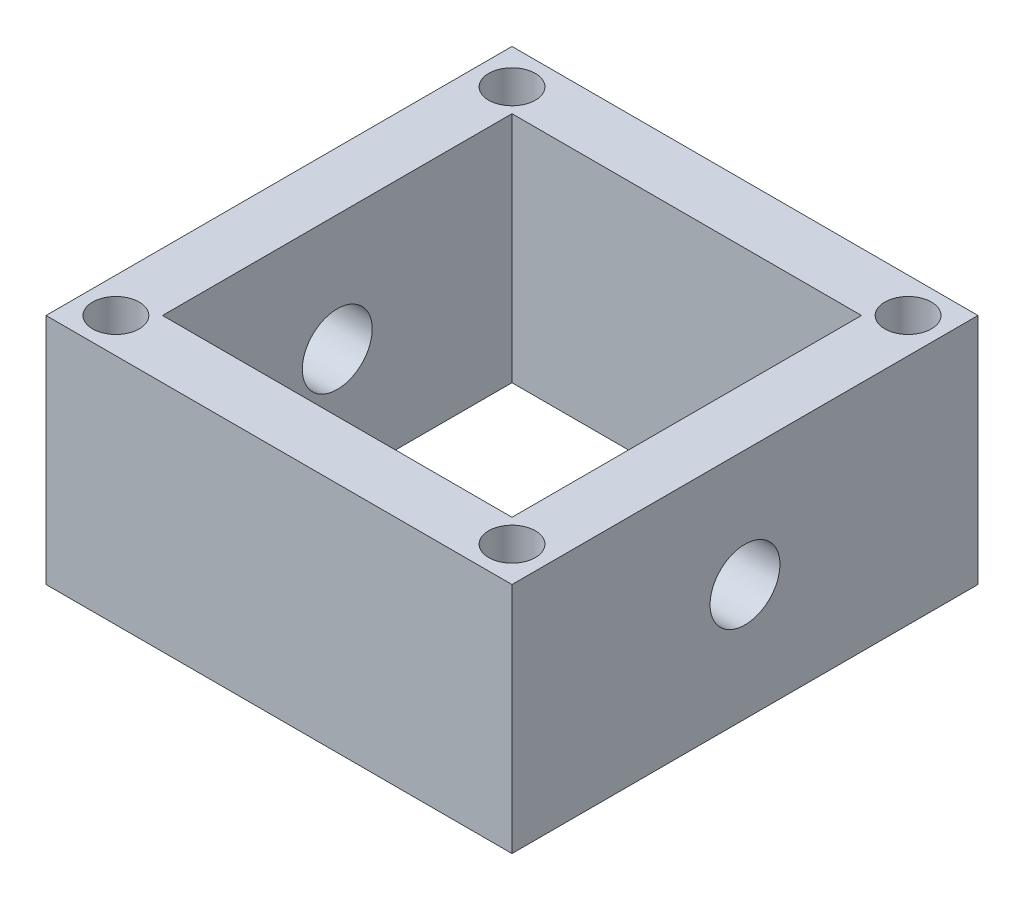
ISO-10303-21;
HEADER;
FILE_DESCRIPTION(('STEP AP214'),'2;1');
FILE_NAME('part.step','',(''),(''),'','','');
FILE_SCHEMA(('AUTOMOTIVE_DESIGN { 1 0 10303 214 1 1 1 1 }'));
ENDSEC;
DATA;
#1=APPLICATION_CONTEXT('core data for automotive mechanical design processes');
#2=APPLICATION_PROTOCOL_DEFINITION('international standard','automotive_design',2000,#1);
#3=PRODUCT_CONTEXT('',#1,'mechanical');
#4=PRODUCT('Part','Part','',(#3));
#5=PRODUCT_RELATED_PRODUCT_CATEGORY('part','',(#4));
#6=PRODUCT_DEFINITION_FORMATION('','',#4);
#7=PRODUCT_DEFINITION_CONTEXT('part definition',#1,'design');
#8=PRODUCT_DEFINITION('design','',#6,#7);
#9=PRODUCT_DEFINITION_SHAPE('','',#8);
#10=(LENGTH_UNIT() NAMED_UNIT(*) SI_UNIT(.MILLI.,.METRE.));
#11=(NAMED_UNIT(*) PLANE_ANGLE_UNIT() SI_UNIT($,.RADIAN.));
#12=(NAMED_UNIT(*) SI_UNIT($,.STERADIAN.) SOLID_ANGLE_UNIT());
#13=UNCERTAINTY_MEASURE_WITH_UNIT(LENGTH_MEASURE(1.E-05),#10,'distance_accuracy_value','');
#14=(GEOMETRIC_REPRESENTATION_CONTEXT(3) GLOBAL_UNCERTAINTY_ASSIGNED_CONTEXT((#13)) GLOBAL_UNIT_ASSIGNED_CONTEXT((#10,
#11,#12)) REPRESENTATION_CONTEXT('',''));
#15=CARTESIAN_POINT('',(0.,0.,0.));
#16=DIRECTION('',(0.,0.,1.));
#17=DIRECTION('',(1.,0.,0.));
#18=AXIS2_PLACEMENT_3D('',#15,#16,#17);
#19=CARTESIAN_POINT('',(0.,10.,0.));
#20=DIRECTION('',(0.,1.,0.));
#21=DIRECTION('',(0.,0.,1.));
#22=AXIS2_PLACEMENT_3D('',#19,#20,#21);
#23=PLANE('',#22);
#24=CARTESIAN_POINT('',(-8.5,10.,8.5));
#25=DIRECTION('',(0.,1.,0.));
#26=DIRECTION('',(0.,0.,1.));
#27=AXIS2_PLACEMENT_3D('',#24,#25,#26);
#28=CIRCLE('',#27,1.);
#29=CARTESIAN_POINT('',(-8.5,10.,9.5));
#30=VERTEX_POINT('',#29);
#31=EDGE_CURVE('E236',#30,#30,#28,.T.);
#32=ORIENTED_EDGE('',*,*,#31,.F.);
#33=EDGE_LOOP('',(#32));
#34=FACE_BOUND('',#33,.T.);
#35=CARTESIAN_POINT('',(8.5,10.,8.5));
#36=DIRECTION('',(0.,1.,0.));
#37=DIRECTION('',(0.,0.,1.));
#38=AXIS2_PLACEMENT_3D('',#35,#36,#37);
#39=CIRCLE('',#38,1.);
#40=CARTESIAN_POINT('',(8.5,10.,9.5));
#41=VERTEX_POINT('',#40);
#42=EDGE_CURVE('E242',#41,#41,#39,.T.);
#43=ORIENTED_EDGE('',*,*,#42,.F.);
#44=EDGE_LOOP('',(#43));
#45=FACE_BOUND('',#44,.T.);
#46=CARTESIAN_POINT('',(8.5,10.,-8.5));
#47=DIRECTION('',(0.,1.,0.));
#48=DIRECTION('',(0.,0.,1.));
#49=AXIS2_PLACEMENT_3D('',#46,#47,#48);
#50=CIRCLE('',#49,1.);
#51=CARTESIAN_POINT('',(8.5,10.,-7.5));
#52=VERTEX_POINT('',#51);
#53=EDGE_CURVE('E230',#52,#52,#50,.T.);
#54=ORIENTED_EDGE('',*,*,#53,.F.);
#55=EDGE_LOOP('',(#54));
#56=FACE_BOUND('',#55,.T.);
#57=CARTESIAN_POINT('',(-8.5,10.,-8.5));
#58=DIRECTION('',(0.,1.,0.));
#59=DIRECTION('',(0.,0.,1.));
#60=AXIS2_PLACEMENT_3D('',#57,#58,#59);
#61=CIRCLE('',#60,1.);
#62=CARTESIAN_POINT('',(-8.5,10.,-7.5));
#63=VERTEX_POINT('',#62);
#64=EDGE_CURVE('E227',#63,#63,#61,.T.);
#65=ORIENTED_EDGE('',*,*,#64,.F.);
#66=EDGE_LOOP('',(#65));
#67=FACE_BOUND('',#66,.T.);
#68=DIRECTION('',(0.,0.,-1.));
#69=VECTOR('',#68,1.);
#70=CARTESIAN_POINT('',(10.,10.,-10.));
#71=LINE('',#70,#69);
#72=CARTESIAN_POINT('',(10.,10.,10.));
#73=VERTEX_POINT('',#72);
#74=CARTESIAN_POINT('',(10.,10.,-10.));
#75=VERTEX_POINT('',#74);
#76=EDGE_CURVE('E141',#73,#75,#71,.T.);
#77=ORIENTED_EDGE('',*,*,#76,.T.);
#78=DIRECTION('',(-1.,0.,0.));
#79=VECTOR('',#78,1.);
#80=CARTESIAN_POINT('',(-10.,10.,-10.));
#81=LINE('',#80,#79);
#82=CARTESIAN_POINT('',(-10.,10.,-10.));
#83=VERTEX_POINT('',#82);
#84=EDGE_CURVE('E144',#75,#83,#81,.T.);
#85=ORIENTED_EDGE('',*,*,#84,.T.);
#86=DIRECTION('',(0.,0.,1.));
#87=VECTOR('',#86,1.);
#88=CARTESIAN_POINT('',(-10.,10.,-10.));
#89=LINE('',#88,#87);
#90=CARTESIAN_POINT('',(-10.,10.,10.));
#91=VERTEX_POINT('',#90);
#92=EDGE_CURVE('E147',#83,#91,#89,.T.);
#93=ORIENTED_EDGE('',*,*,#92,.T.);
#94=DIRECTION('',(1.,0.,0.));
#95=VECTOR('',#94,1.);
#96=CARTESIAN_POINT('',(-10.,10.,10.));
#97=LINE('',#96,#95);
#98=EDGE_CURVE('E149',#91,#73,#97,.T.);
#99=ORIENTED_EDGE('',*,*,#98,.T.);
#100=EDGE_LOOP('',(#77,#85,#93,#99));
#101=FACE_BOUND('',#100,.T.);
#102=DIRECTION('',(-1.,0.,0.));
#103=VECTOR('',#102,1.);
#104=CARTESIAN_POINT('',(-7.5,10.,-7.5));
#105=LINE('',#104,#103);
#106=CARTESIAN_POINT('',(7.5,10.,-7.5));
#107=VERTEX_POINT('',#106);
#108=CARTESIAN_POINT('',(-7.5,10.,-7.5));
#109=VERTEX_POINT('',#108);
#110=EDGE_CURVE('E111',#107,#109,#105,.T.);
#111=ORIENTED_EDGE('',*,*,#110,.F.);
#112=DIRECTION('',(0.,0.,-1.));
#113=VECTOR('',#112,1.);
#114=CARTESIAN_POINT('',(7.5,10.,-7.5));
#115=LINE('',#114,#113);
#116=CARTESIAN_POINT('',(7.5,10.,7.5));
#117=VERTEX_POINT('',#116);
#118=EDGE_CURVE('E103',#117,#107,#115,.T.);
#119=ORIENTED_EDGE('',*,*,#118,.F.);
#120=DIRECTION('',(1.,0.,0.));
#121=VECTOR('',#120,1.);
#122=CARTESIAN_POINT('',(-7.5,10.,7.5));
#123=LINE('',#122,#121);
#124=CARTESIAN_POINT('',(-7.5,10.,7.5));
#125=VERTEX_POINT('',#124);
#126=EDGE_CURVE('E125',#125,#117,#123,.T.);
#127=ORIENTED_EDGE('',*,*,#126,.F.);
#128=DIRECTION('',(0.,0.,1.));
#129=VECTOR('',#128,1.);
#130=CARTESIAN_POINT('',(-7.5,10.,-7.5));
#131=LINE('',#130,#129);
#132=EDGE_CURVE('E123',#109,#125,#131,.T.);
#133=ORIENTED_EDGE('',*,*,#132,.F.);
#134=EDGE_LOOP('',(#111,#119,#127,#133));
#135=FACE_BOUND('',#134,.T.);
#136=ADVANCED_FACE('F37',(#34,#45,#56,#67,#101,#135),#23,.T.);
#137=CARTESIAN_POINT('',(0.,0.,0.));
#138=DIRECTION('',(0.,1.,0.));
#139=DIRECTION('',(0.,0.,1.));
#140=AXIS2_PLACEMENT_3D('',#137,#138,#139);
#141=PLANE('',#140);
#142=DIRECTION('',(0.,0.,-1.));
#143=VECTOR('',#142,1.);
#144=CARTESIAN_POINT('',(10.,0.,-10.));
#145=LINE('',#144,#143);
#146=CARTESIAN_POINT('',(10.,0.,10.));
#147=VERTEX_POINT('',#146);
#148=CARTESIAN_POINT('',(10.,0.,-10.));
#149=VERTEX_POINT('',#148);
#150=EDGE_CURVE('E119',#147,#149,#145,.T.);
#151=ORIENTED_EDGE('',*,*,#150,.F.);
#152=DIRECTION('',(1.,0.,0.));
#153=VECTOR('',#152,1.);
#154=CARTESIAN_POINT('',(-10.,0.,10.));
#155=LINE('',#154,#153);
#156=CARTESIAN_POINT('',(-10.,0.,10.));
#157=VERTEX_POINT('',#156);
#158=EDGE_CURVE('E145',#157,#147,#155,.T.);
#159=ORIENTED_EDGE('',*,*,#158,.F.);
#160=DIRECTION('',(0.,0.,1.));
#161=VECTOR('',#160,1.);
#162=CARTESIAN_POINT('',(-10.,0.,-10.));
#163=LINE('',#162,#161);
#164=CARTESIAN_POINT('',(-10.,0.,-10.));
#165=VERTEX_POINT('',#164);
#166=EDGE_CURVE('E156',#165,#157,#163,.T.);
#167=ORIENTED_EDGE('',*,*,#166,.F.);
#168=DIRECTION('',(-1.,0.,0.));
#169=VECTOR('',#168,1.);
#170=CARTESIAN_POINT('',(-10.,0.,-10.));
#171=LINE('',#170,#169);
#172=EDGE_CURVE('E154',#149,#165,#171,.T.);
#173=ORIENTED_EDGE('',*,*,#172,.F.);
#174=EDGE_LOOP('',(#151,#159,#167,#173));
#175=FACE_BOUND('',#174,.T.);
#176=DIRECTION('',(0.,0.,-1.));
#177=VECTOR('',#176,1.);
#178=CARTESIAN_POINT('',(7.5,0.,-7.5));
#179=LINE('',#178,#177);
#180=CARTESIAN_POINT('',(7.5,0.,7.5));
#181=VERTEX_POINT('',#180);
#182=CARTESIAN_POINT('',(7.5,0.,-7.5));
#183=VERTEX_POINT('',#182);
#184=EDGE_CURVE('E61',#181,#183,#179,.T.);
#185=ORIENTED_EDGE('',*,*,#184,.T.);
#186=DIRECTION('',(-1.,0.,0.));
#187=VECTOR('',#186,1.);
#188=CARTESIAN_POINT('',(-7.5,0.,-7.5));
#189=LINE('',#188,#187);
#190=CARTESIAN_POINT('',(-7.5,0.,-7.5));
#191=VERTEX_POINT('',#190);
#192=EDGE_CURVE('E118',#183,#191,#189,.T.);
#193=ORIENTED_EDGE('',*,*,#192,.T.);
#194=DIRECTION('',(0.,0.,1.));
#195=VECTOR('',#194,1.);
#196=CARTESIAN_POINT('',(-7.5,0.,-7.5));
#197=LINE('',#196,#195);
#198=CARTESIAN_POINT('',(-7.5,0.,7.5));
#199=VERTEX_POINT('',#198);
#200=EDGE_CURVE('E133',#191,#199,#197,.T.);
#201=ORIENTED_EDGE('',*,*,#200,.T.);
#202=DIRECTION('',(1.,0.,0.));
#203=VECTOR('',#202,1.);
#204=CARTESIAN_POINT('',(-7.5,0.,7.5));
#205=LINE('',#204,#203);
#206=EDGE_CURVE('E112',#199,#181,#205,.T.);
#207=ORIENTED_EDGE('',*,*,#206,.T.);
#208=EDGE_LOOP('',(#185,#193,#201,#207));
#209=FACE_BOUND('',#208,.T.);
#210=ADVANCED_FACE('F175',(#175,#209),#141,.F.);
#211=CARTESIAN_POINT('',(10.,10.,-10.));
#212=DIRECTION('',(-1.,0.,0.));
#213=DIRECTION('',(0.,0.,1.));
#214=AXIS2_PLACEMENT_3D('',#211,#212,#213);
#215=PLANE('',#214);
#216=CARTESIAN_POINT('',(10.,5.,0.));
#217=DIRECTION('',(-1.,0.,0.));
#218=DIRECTION('',(0.,0.,1.));
#219=AXIS2_PLACEMENT_3D('',#216,#217,#218);
#220=CIRCLE('',#219,1.5);
#221=CARTESIAN_POINT('',(10.,5.,1.5));
#222=VERTEX_POINT('',#221);
#223=EDGE_CURVE('E219',#222,#222,#220,.T.);
#224=ORIENTED_EDGE('',*,*,#223,.T.);
#225=EDGE_LOOP('',(#224));
#226=FACE_BOUND('',#225,.T.);
#227=ORIENTED_EDGE('',*,*,#150,.T.);
#228=DIRECTION('',(0.,-1.,0.));
#229=VECTOR('',#228,1.);
#230=CARTESIAN_POINT('',(10.,10.,-10.));
#231=LINE('',#230,#229);
#232=EDGE_CURVE('E11',#75,#149,#231,.T.);
#233=ORIENTED_EDGE('',*,*,#232,.F.);
#234=ORIENTED_EDGE('',*,*,#76,.F.);
#235=DIRECTION('',(0.,-1.,0.));
#236=VECTOR('',#235,1.);
#237=CARTESIAN_POINT('',(10.,10.,10.));
#238=LINE('',#237,#236);
#239=EDGE_CURVE('E151',#73,#147,#238,.T.);
#240=ORIENTED_EDGE('',*,*,#239,.T.);
#241=EDGE_LOOP('',(#227,#233,#234,#240));
#242=FACE_BOUND('',#241,.T.);
#243=ADVANCED_FACE('F39',(#226,#242),#215,.F.);
#244=CARTESIAN_POINT('',(-10.,10.,-10.));
#245=DIRECTION('',(0.,0.,1.));
#246=DIRECTION('',(1.,0.,0.));
#247=AXIS2_PLACEMENT_3D('',#244,#245,#246);
#248=PLANE('',#247);
#249=ORIENTED_EDGE('',*,*,#172,.T.);
#250=DIRECTION('',(0.,-1.,0.));
#251=VECTOR('',#250,1.);
#252=CARTESIAN_POINT('',(-10.,10.,-10.));
#253=LINE('',#252,#251);
#254=EDGE_CURVE('E46',#83,#165,#253,.T.);
#255=ORIENTED_EDGE('',*,*,#254,.F.);
#256=ORIENTED_EDGE('',*,*,#84,.F.);
#257=ORIENTED_EDGE('',*,*,#232,.T.);
#258=EDGE_LOOP('',(#249,#255,#256,#257));
#259=FACE_BOUND('',#258,.T.);
#260=ADVANCED_FACE('F185',(#259),#248,.F.);
#261=CARTESIAN_POINT('',(-10.,10.,-10.));
#262=DIRECTION('',(1.,0.,0.));
#263=DIRECTION('',(0.,0.,-1.));
#264=AXIS2_PLACEMENT_3D('',#261,#262,#263);
#265=PLANE('',#264);
#266=CARTESIAN_POINT('',(-10.,5.,0.));
#267=DIRECTION('',(-1.,0.,0.));
#268=DIRECTION('',(0.,0.,1.));
#269=AXIS2_PLACEMENT_3D('',#266,#267,#268);
#270=CIRCLE('',#269,1.5);
#271=CARTESIAN_POINT('',(-10.,5.,1.5));
#272=VERTEX_POINT('',#271);
#273=EDGE_CURVE('E221',#272,#272,#270,.T.);
#274=ORIENTED_EDGE('',*,*,#273,.F.);
#275=EDGE_LOOP('',(#274));
#276=FACE_BOUND('',#275,.T.);
#277=ORIENTED_EDGE('',*,*,#166,.T.);
#278=DIRECTION('',(0.,-1.,0.));
#279=VECTOR('',#278,1.);
#280=CARTESIAN_POINT('',(-10.,10.,10.));
#281=LINE('',#280,#279);
#282=EDGE_CURVE('E161',#91,#157,#281,.T.);
#283=ORIENTED_EDGE('',*,*,#282,.F.);
#284=ORIENTED_EDGE('',*,*,#92,.F.);
#285=ORIENTED_EDGE('',*,*,#254,.T.);
#286=EDGE_LOOP('',(#277,#283,#284,#285));
#287=FACE_BOUND('',#286,.T.);
#288=ADVANCED_FACE('F169',(#276,#287),#265,.F.);
#289=CARTESIAN_POINT('',(-10.,10.,10.));
#290=DIRECTION('',(0.,0.,-1.));
#291=DIRECTION('',(-1.,0.,0.));
#292=AXIS2_PLACEMENT_3D('',#289,#290,#291);
#293=PLANE('',#292);
#294=ORIENTED_EDGE('',*,*,#158,.T.);
#295=ORIENTED_EDGE('',*,*,#239,.F.);
#296=ORIENTED_EDGE('',*,*,#98,.F.);
#297=ORIENTED_EDGE('',*,*,#282,.T.);
#298=EDGE_LOOP('',(#294,#295,#296,#297));
#299=FACE_BOUND('',#298,.T.);
#300=ADVANCED_FACE('F179',(#299),#293,.F.);
#301=CARTESIAN_POINT('',(7.5,10.,-7.5));
#302=DIRECTION('',(-1.,0.,0.));
#303=DIRECTION('',(0.,0.,1.));
#304=AXIS2_PLACEMENT_3D('',#301,#302,#303);
#305=PLANE('',#304);
#306=CARTESIAN_POINT('',(7.5,5.,0.));
#307=DIRECTION('',(-1.,0.,0.));
#308=DIRECTION('',(0.,0.,1.));
#309=AXIS2_PLACEMENT_3D('',#306,#307,#308);
#310=CIRCLE('',#309,1.5);
#311=CARTESIAN_POINT('',(7.5,5.,1.5));
#312=VERTEX_POINT('',#311);
#313=EDGE_CURVE('E131',#312,#312,#310,.T.);
#314=ORIENTED_EDGE('',*,*,#313,.F.);
#315=EDGE_LOOP('',(#314));
#316=FACE_BOUND('',#315,.T.);
#317=ORIENTED_EDGE('',*,*,#184,.F.);
#318=DIRECTION('',(0.,-1.,0.));
#319=VECTOR('',#318,1.);
#320=CARTESIAN_POINT('',(7.5,10.,7.5));
#321=LINE('',#320,#319);
#322=EDGE_CURVE('E107',#117,#181,#321,.T.);
#323=ORIENTED_EDGE('',*,*,#322,.F.);
#324=ORIENTED_EDGE('',*,*,#118,.T.);
#325=DIRECTION('',(0.,-1.,0.));
#326=VECTOR('',#325,1.);
#327=CARTESIAN_POINT('',(7.5,10.,-7.5));
#328=LINE('',#327,#326);
#329=EDGE_CURVE('E106',#107,#183,#328,.T.);
#330=ORIENTED_EDGE('',*,*,#329,.T.);
#331=EDGE_LOOP('',(#317,#323,#324,#330));
#332=FACE_BOUND('',#331,.T.);
#333=ADVANCED_FACE('F105',(#316,#332),#305,.T.);
#334=CARTESIAN_POINT('',(-7.5,10.,-7.5));
#335=DIRECTION('',(0.,0.,1.));
#336=DIRECTION('',(1.,0.,0.));
#337=AXIS2_PLACEMENT_3D('',#334,#335,#336);
#338=PLANE('',#337);
#339=ORIENTED_EDGE('',*,*,#192,.F.);
#340=ORIENTED_EDGE('',*,*,#329,.F.);
#341=ORIENTED_EDGE('',*,*,#110,.T.);
#342=DIRECTION('',(0.,-1.,0.));
#343=VECTOR('',#342,1.);
#344=CARTESIAN_POINT('',(-7.5,10.,-7.5));
#345=LINE('',#344,#343);
#346=EDGE_CURVE('E120',#109,#191,#345,.T.);
#347=ORIENTED_EDGE('',*,*,#346,.T.);
#348=EDGE_LOOP('',(#339,#340,#341,#347));
#349=FACE_BOUND('',#348,.T.);
#350=ADVANCED_FACE('F115',(#349),#338,.T.);
#351=CARTESIAN_POINT('',(-7.5,10.,-7.5));
#352=DIRECTION('',(1.,0.,0.));
#353=DIRECTION('',(0.,0.,-1.));
#354=AXIS2_PLACEMENT_3D('',#351,#352,#353);
#355=PLANE('',#354);
#356=CARTESIAN_POINT('',(-7.5,5.,0.));
#357=DIRECTION('',(1.,0.,0.));
#358=DIRECTION('',(0.,0.,-1.));
#359=AXIS2_PLACEMENT_3D('',#356,#357,#358);
#360=CIRCLE('',#359,1.5);
#361=CARTESIAN_POINT('',(-7.5,5.,-1.5));
#362=VERTEX_POINT('',#361);
#363=EDGE_CURVE('E41',#362,#362,#360,.T.);
#364=ORIENTED_EDGE('',*,*,#363,.F.);
#365=EDGE_LOOP('',(#364));
#366=FACE_BOUND('',#365,.T.);
#367=ORIENTED_EDGE('',*,*,#200,.F.);
#368=ORIENTED_EDGE('',*,*,#346,.F.);
#369=ORIENTED_EDGE('',*,*,#132,.T.);
#370=DIRECTION('',(0.,-1.,0.));
#371=VECTOR('',#370,1.);
#372=CARTESIAN_POINT('',(-7.5,10.,7.5));
#373=LINE('',#372,#371);
#374=EDGE_CURVE('E53',#125,#199,#373,.T.);
#375=ORIENTED_EDGE('',*,*,#374,.T.);
#376=EDGE_LOOP('',(#367,#368,#369,#375));
#377=FACE_BOUND('',#376,.T.);
#378=ADVANCED_FACE('F214',(#366,#377),#355,.T.);
#379=CARTESIAN_POINT('',(-7.5,10.,7.5));
#380=DIRECTION('',(0.,0.,-1.));
#381=DIRECTION('',(-1.,0.,0.));
#382=AXIS2_PLACEMENT_3D('',#379,#380,#381);
#383=PLANE('',#382);
#384=ORIENTED_EDGE('',*,*,#206,.F.);
#385=ORIENTED_EDGE('',*,*,#374,.F.);
#386=ORIENTED_EDGE('',*,*,#126,.T.);
#387=ORIENTED_EDGE('',*,*,#322,.T.);
#388=EDGE_LOOP('',(#384,#385,#386,#387));
#389=FACE_BOUND('',#388,.T.);
#390=ADVANCED_FACE('F274',(#389),#383,.T.);
#391=CARTESIAN_POINT('',(10.,5.,0.));
#392=DIRECTION('',(-1.,0.,0.));
#393=DIRECTION('',(0.,0.,1.));
#394=AXIS2_PLACEMENT_3D('',#391,#392,#393);
#395=CYLINDRICAL_SURFACE('',#394,1.5);
#396=ORIENTED_EDGE('',*,*,#363,.T.);
#397=EDGE_LOOP('',(#396));
#398=FACE_BOUND('',#397,.T.);
#399=ORIENTED_EDGE('',*,*,#273,.T.);
#400=EDGE_LOOP('',(#399));
#401=FACE_BOUND('',#400,.T.);
#402=ADVANCED_FACE('F268',(#398,#401),#395,.F.);
#403=ORIENTED_EDGE('',*,*,#313,.T.);
#404=EDGE_LOOP('',(#403));
#405=FACE_BOUND('',#404,.T.);
#406=ORIENTED_EDGE('',*,*,#223,.F.);
#407=EDGE_LOOP('',(#406));
#408=FACE_BOUND('',#407,.T.);
#409=ADVANCED_FACE('F259',(#405,#408),#395,.F.);
#410=CARTESIAN_POINT('',(-8.5,4.,-8.5));
#411=DIRECTION('',(0.,1.,0.));
#412=DIRECTION('',(0.,0.,1.));
#413=AXIS2_PLACEMENT_3D('',#410,#411,#412);
#414=CYLINDRICAL_SURFACE('',#413,1.);
#415=CARTESIAN_POINT('',(-8.5,4.,-8.5));
#416=DIRECTION('',(0.,1.,0.));
#417=DIRECTION('',(0.,0.,1.));
#418=AXIS2_PLACEMENT_3D('',#415,#416,#417);
#419=CIRCLE('',#418,1.);
#420=CARTESIAN_POINT('',(-8.5,4.,-7.5));
#421=VERTEX_POINT('',#420);
#422=EDGE_CURVE('E224',#421,#421,#419,.T.);
#423=ORIENTED_EDGE('',*,*,#422,.F.);
#424=EDGE_LOOP('',(#423));
#425=FACE_BOUND('',#424,.T.);
#426=ORIENTED_EDGE('',*,*,#64,.T.);
#427=EDGE_LOOP('',(#426));
#428=FACE_BOUND('',#427,.T.);
#429=ADVANCED_FACE('F256',(#425,#428),#414,.F.);
#430=CARTESIAN_POINT('',(-8.5,4.,-8.5));
#431=DIRECTION('',(0.,1.,0.));
#432=DIRECTION('',(0.,0.,1.));
#433=AXIS2_PLACEMENT_3D('',#430,#431,#432);
#434=PLANE('',#433);
#435=ORIENTED_EDGE('',*,*,#422,.T.);
#436=EDGE_LOOP('',(#435));
#437=FACE_BOUND('',#436,.T.);
#438=ADVANCED_FACE('F258',(#437),#434,.T.);
#439=CARTESIAN_POINT('',(8.5,4.,-8.5));
#440=DIRECTION('',(0.,1.,0.));
#441=DIRECTION('',(0.,0.,1.));
#442=AXIS2_PLACEMENT_3D('',#439,#440,#441);
#443=CYLINDRICAL_SURFACE('',#442,1.);
#444=CARTESIAN_POINT('',(8.5,4.,-8.5));
#445=DIRECTION('',(0.,1.,0.));
#446=DIRECTION('',(0.,0.,1.));
#447=AXIS2_PLACEMENT_3D('',#444,#445,#446);
#448=CIRCLE('',#447,1.);
#449=CARTESIAN_POINT('',(8.5,4.,-7.5));
#450=VERTEX_POINT('',#449);
#451=EDGE_CURVE('E245',#450,#450,#448,.T.);
#452=ORIENTED_EDGE('',*,*,#451,.F.);
#453=EDGE_LOOP('',(#452));
#454=FACE_BOUND('',#453,.T.);
#455=ORIENTED_EDGE('',*,*,#53,.T.);
#456=EDGE_LOOP('',(#455));
#457=FACE_BOUND('',#456,.T.);
#458=ADVANCED_FACE('F251',(#454,#457),#443,.F.);
#459=CARTESIAN_POINT('',(8.5,4.,-8.5));
#460=DIRECTION('',(0.,1.,0.));
#461=DIRECTION('',(0.,0.,1.));
#462=AXIS2_PLACEMENT_3D('',#459,#460,#461);
#463=PLANE('',#462);
#464=ORIENTED_EDGE('',*,*,#451,.T.);
#465=EDGE_LOOP('',(#464));
#466=FACE_BOUND('',#465,.T.);
#467=ADVANCED_FACE('F330',(#466),#463,.T.);
#468=CARTESIAN_POINT('',(8.5,4.,8.5));
#469=DIRECTION('',(0.,1.,0.));
#470=DIRECTION('',(0.,0.,1.));
#471=AXIS2_PLACEMENT_3D('',#468,#469,#470);
#472=CYLINDRICAL_SURFACE('',#471,1.);
#473=CARTESIAN_POINT('',(8.5,4.,8.5));
#474=DIRECTION('',(0.,1.,0.));
#475=DIRECTION('',(0.,0.,1.));
#476=AXIS2_PLACEMENT_3D('',#473,#474,#475);
#477=CIRCLE('',#476,1.);
#478=CARTESIAN_POINT('',(8.5,4.,9.5));
#479=VERTEX_POINT('',#478);
#480=EDGE_CURVE('E239',#479,#479,#477,.T.);
#481=ORIENTED_EDGE('',*,*,#480,.F.);
#482=EDGE_LOOP('',(#481));
#483=FACE_BOUND('',#482,.T.);
#484=ORIENTED_EDGE('',*,*,#42,.T.);
#485=EDGE_LOOP('',(#484));
#486=FACE_BOUND('',#485,.T.);
#487=ADVANCED_FACE('F341',(#483,#486),#472,.F.);
#488=CARTESIAN_POINT('',(8.5,4.,8.5));
#489=DIRECTION('',(0.,1.,0.));
#490=DIRECTION('',(0.,0.,1.));
#491=AXIS2_PLACEMENT_3D('',#488,#489,#490);
#492=PLANE('',#491);
#493=ORIENTED_EDGE('',*,*,#480,.T.);
#494=EDGE_LOOP('',(#493));
#495=FACE_BOUND('',#494,.T.);
#496=ADVANCED_FACE('F352',(#495),#492,.T.);
#497=CARTESIAN_POINT('',(-8.5,4.,8.5));
#498=DIRECTION('',(0.,1.,0.));
#499=DIRECTION('',(0.,0.,1.));
#500=AXIS2_PLACEMENT_3D('',#497,#498,#499);
#501=CYLINDRICAL_SURFACE('',#500,1.);
#502=CARTESIAN_POINT('',(-8.5,4.,8.5));
#503=DIRECTION('',(0.,1.,0.));
#504=DIRECTION('',(0.,0.,1.));
#505=AXIS2_PLACEMENT_3D('',#502,#503,#504);
#506=CIRCLE('',#505,1.);
#507=CARTESIAN_POINT('',(-8.5,4.,9.5));
#508=VERTEX_POINT('',#507);
#509=EDGE_CURVE('E233',#508,#508,#506,.T.);
#510=ORIENTED_EDGE('',*,*,#509,.F.);
#511=EDGE_LOOP('',(#510));
#512=FACE_BOUND('',#511,.T.);
#513=ORIENTED_EDGE('',*,*,#31,.T.);
#514=EDGE_LOOP('',(#513));
#515=FACE_BOUND('',#514,.T.);
#516=ADVANCED_FACE('F363',(#512,#515),#501,.F.);
#517=CARTESIAN_POINT('',(-8.5,4.,8.5));
#518=DIRECTION('',(0.,1.,0.));
#519=DIRECTION('',(0.,0.,1.));
#520=AXIS2_PLACEMENT_3D('',#517,#518,#519);
#521=PLANE('',#520);
#522=ORIENTED_EDGE('',*,*,#509,.T.);
#523=EDGE_LOOP('',(#522));
#524=FACE_BOUND('',#523,.T.);
#525=ADVANCED_FACE('F374',(#524),#521,.T.);
#526=CLOSED_SHELL('',(#136,#210,#243,#260,#288,#300,#333,#350,#378,#390,#402,#409,#429,#438,
#458,#467,#487,#496,#516,#525));
#527=MANIFOLD_SOLID_BREP('B2',#526);
#528=ADVANCED_BREP_SHAPE_REPRESENTATION('',(#18,#527),#14);
#529=SHAPE_DEFINITION_REPRESENTATION(#9,#528);
ENDSEC;
END-ISO-10303-21;
